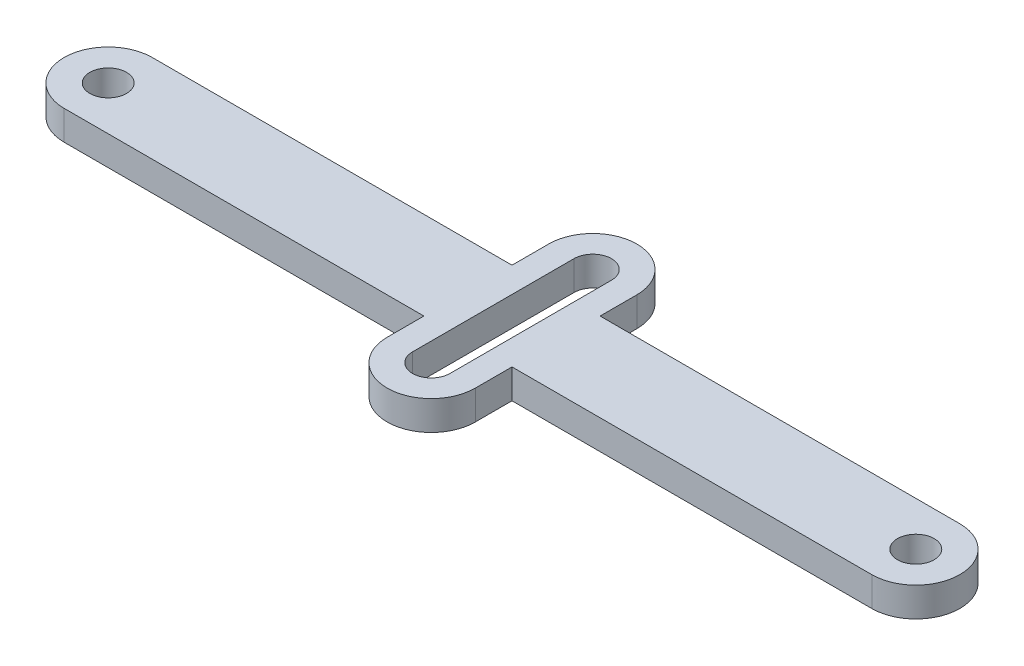
ISO-10303-21;
HEADER;
FILE_DESCRIPTION(('STEP AP214'),'2;1');
FILE_NAME('part.step','',(''),(''),'','','');
FILE_SCHEMA(('AUTOMOTIVE_DESIGN { 1 0 10303 214 1 1 1 1 }'));
ENDSEC;
DATA;
#1=APPLICATION_CONTEXT('core data for automotive mechanical design processes');
#2=APPLICATION_PROTOCOL_DEFINITION('international standard','automotive_design',2000,#1);
#3=PRODUCT_CONTEXT('',#1,'mechanical');
#4=PRODUCT('Part','Part','',(#3));
#5=PRODUCT_RELATED_PRODUCT_CATEGORY('part','',(#4));
#6=PRODUCT_DEFINITION_FORMATION('','',#4);
#7=PRODUCT_DEFINITION_CONTEXT('part definition',#1,'design');
#8=PRODUCT_DEFINITION('design','',#6,#7);
#9=PRODUCT_DEFINITION_SHAPE('','',#8);
#10=(LENGTH_UNIT() NAMED_UNIT(*) SI_UNIT(.MILLI.,.METRE.));
#11=(NAMED_UNIT(*) PLANE_ANGLE_UNIT() SI_UNIT($,.RADIAN.));
#12=(NAMED_UNIT(*) SI_UNIT($,.STERADIAN.) SOLID_ANGLE_UNIT());
#13=UNCERTAINTY_MEASURE_WITH_UNIT(LENGTH_MEASURE(1.E-05),#10,'distance_accuracy_value','');
#14=(GEOMETRIC_REPRESENTATION_CONTEXT(3) GLOBAL_UNCERTAINTY_ASSIGNED_CONTEXT((#13)) GLOBAL_UNIT_ASSIGNED_CONTEXT((#10,
#11,#12)) REPRESENTATION_CONTEXT('',''));
#15=CARTESIAN_POINT('',(0.,0.,0.));
#16=DIRECTION('',(0.,0.,1.));
#17=DIRECTION('',(1.,0.,0.));
#18=AXIS2_PLACEMENT_3D('',#15,#16,#17);
#19=CARTESIAN_POINT('',(-55.,4.,5.99999999999998));
#20=DIRECTION('',(0.,0.,-1.));
#21=DIRECTION('',(-1.,0.,0.));
#22=AXIS2_PLACEMENT_3D('',#19,#20,#21);
#23=PLANE('',#22);
#24=DIRECTION('',(1.,0.,0.));
#25=VECTOR('',#24,1.);
#26=CARTESIAN_POINT('',(-55.,0.,5.99999999999998));
#27=LINE('',#26,#25);
#28=CARTESIAN_POINT('',(-55.,0.,5.99999999999998));
#29=VERTEX_POINT('',#28);
#30=CARTESIAN_POINT('',(-6.00000000000001,0.,5.99999999999997));
#31=VERTEX_POINT('',#30);
#32=EDGE_CURVE('E285',#29,#31,#27,.T.);
#33=ORIENTED_EDGE('',*,*,#32,.T.);
#34=DIRECTION('',(0.,1.,0.));
#35=VECTOR('',#34,1.);
#36=CARTESIAN_POINT('',(-6.00000000000001,4.,5.99999999999997));
#37=LINE('',#36,#35);
#38=CARTESIAN_POINT('',(-6.00000000000001,4.,5.99999999999997));
#39=VERTEX_POINT('',#38);
#40=EDGE_CURVE('E242',#31,#39,#37,.T.);
#41=ORIENTED_EDGE('',*,*,#40,.T.);
#42=DIRECTION('',(1.,0.,0.));
#43=VECTOR('',#42,1.);
#44=CARTESIAN_POINT('',(-55.,4.,5.99999999999998));
#45=LINE('',#44,#43);
#46=CARTESIAN_POINT('',(-55.,4.,5.99999999999998));
#47=VERTEX_POINT('',#46);
#48=EDGE_CURVE('E268',#47,#39,#45,.T.);
#49=ORIENTED_EDGE('',*,*,#48,.F.);
#50=DIRECTION('',(0.,-1.,0.));
#51=VECTOR('',#50,1.);
#52=CARTESIAN_POINT('',(-55.,4.,5.99999999999998));
#53=LINE('',#52,#51);
#54=EDGE_CURVE('E305',#47,#29,#53,.T.);
#55=ORIENTED_EDGE('',*,*,#54,.T.);
#56=EDGE_LOOP('',(#33,#41,#49,#55));
#57=FACE_BOUND('',#56,.T.);
#58=ADVANCED_FACE('F39',(#57),#23,.F.);
#59=CARTESIAN_POINT('',(-55.,4.,-5.99999999999994));
#60=DIRECTION('',(0.,0.,1.));
#61=DIRECTION('',(1.,0.,0.));
#62=AXIS2_PLACEMENT_3D('',#59,#60,#61);
#63=PLANE('',#62);
#64=DIRECTION('',(-1.,0.,0.));
#65=VECTOR('',#64,1.);
#66=CARTESIAN_POINT('',(-55.,4.,-5.99999999999994));
#67=LINE('',#66,#65);
#68=CARTESIAN_POINT('',(-6.00000000000001,4.,-5.99999999999995));
#69=VERTEX_POINT('',#68);
#70=CARTESIAN_POINT('',(-55.,4.,-5.99999999999994));
#71=VERTEX_POINT('',#70);
#72=EDGE_CURVE('E275',#69,#71,#67,.T.);
#73=ORIENTED_EDGE('',*,*,#72,.F.);
#74=DIRECTION('',(0.,-1.,0.));
#75=VECTOR('',#74,1.);
#76=CARTESIAN_POINT('',(-6.00000000000001,4.,-5.99999999999995));
#77=LINE('',#76,#75);
#78=CARTESIAN_POINT('',(-6.00000000000001,0.,-5.99999999999995));
#79=VERTEX_POINT('',#78);
#80=EDGE_CURVE('E312',#69,#79,#77,.T.);
#81=ORIENTED_EDGE('',*,*,#80,.T.);
#82=DIRECTION('',(-1.,0.,0.));
#83=VECTOR('',#82,1.);
#84=CARTESIAN_POINT('',(-55.,0.,-5.99999999999994));
#85=LINE('',#84,#83);
#86=CARTESIAN_POINT('',(-55.,0.,-5.99999999999994));
#87=VERTEX_POINT('',#86);
#88=EDGE_CURVE('E291',#79,#87,#85,.T.);
#89=ORIENTED_EDGE('',*,*,#88,.T.);
#90=DIRECTION('',(0.,-1.,0.));
#91=VECTOR('',#90,1.);
#92=CARTESIAN_POINT('',(-55.,4.,-5.99999999999994));
#93=LINE('',#92,#91);
#94=EDGE_CURVE('E280',#71,#87,#93,.T.);
#95=ORIENTED_EDGE('',*,*,#94,.F.);
#96=EDGE_LOOP('',(#73,#81,#89,#95));
#97=FACE_BOUND('',#96,.T.);
#98=ADVANCED_FACE('F342',(#97),#63,.F.);
#99=CARTESIAN_POINT('',(-55.,4.,0.));
#100=DIRECTION('',(0.,1.,0.));
#101=DIRECTION('',(0.,0.,1.));
#102=AXIS2_PLACEMENT_3D('',#99,#100,#101);
#103=PLANE('',#102);
#104=CARTESIAN_POINT('',(0.,4.,11.));
#105=DIRECTION('',(0.,1.,0.));
#106=DIRECTION('',(0.,0.,1.));
#107=AXIS2_PLACEMENT_3D('',#104,#105,#106);
#108=CIRCLE('',#107,2.55);
#109=CARTESIAN_POINT('',(-2.55,4.,11.));
#110=VERTEX_POINT('',#109);
#111=CARTESIAN_POINT('',(2.55000000000001,4.,11.));
#112=VERTEX_POINT('',#111);
#113=EDGE_CURVE('E55',#110,#112,#108,.T.);
#114=ORIENTED_EDGE('',*,*,#113,.F.);
#115=DIRECTION('',(0.,0.,1.));
#116=VECTOR('',#115,1.);
#117=CARTESIAN_POINT('',(-2.55,4.,11.));
#118=LINE('',#117,#116);
#119=CARTESIAN_POINT('',(-2.55000000000001,4.,-11.));
#120=VERTEX_POINT('',#119);
#121=EDGE_CURVE('E174',#120,#110,#118,.T.);
#122=ORIENTED_EDGE('',*,*,#121,.F.);
#123=CARTESIAN_POINT('',(0.,4.,-11.));
#124=DIRECTION('',(0.,1.,0.));
#125=DIRECTION('',(0.,0.,1.));
#126=AXIS2_PLACEMENT_3D('',#123,#124,#125);
#127=CIRCLE('',#126,2.55);
#128=CARTESIAN_POINT('',(2.55,4.,-11.));
#129=VERTEX_POINT('',#128);
#130=EDGE_CURVE('E156',#129,#120,#127,.T.);
#131=ORIENTED_EDGE('',*,*,#130,.F.);
#132=DIRECTION('',(0.,0.,-1.));
#133=VECTOR('',#132,1.);
#134=CARTESIAN_POINT('',(2.55,4.,11.));
#135=LINE('',#134,#133);
#136=EDGE_CURVE('E166',#112,#129,#135,.T.);
#137=ORIENTED_EDGE('',*,*,#136,.F.);
#138=EDGE_LOOP('',(#114,#122,#131,#137));
#139=FACE_BOUND('',#138,.T.);
#140=CARTESIAN_POINT('',(55.,4.,-5.99999999999996));
#141=VERTEX_POINT('',#140);
#142=CARTESIAN_POINT('',(6.,4.,-5.99999999999995));
#143=VERTEX_POINT('',#142);
#144=EDGE_CURVE('E276',#141,#143,#67,.T.);
#145=ORIENTED_EDGE('',*,*,#144,.T.);
#146=DIRECTION('',(0.,0.,-1.));
#147=VECTOR('',#146,1.);
#148=CARTESIAN_POINT('',(6.,4.,11.));
#149=LINE('',#148,#147);
#150=CARTESIAN_POINT('',(6.,4.,-11.));
#151=VERTEX_POINT('',#150);
#152=EDGE_CURVE('E207',#143,#151,#149,.T.);
#153=ORIENTED_EDGE('',*,*,#152,.T.);
#154=CARTESIAN_POINT('',(0.,4.,-11.));
#155=DIRECTION('',(0.,1.,0.));
#156=DIRECTION('',(0.,0.,1.));
#157=AXIS2_PLACEMENT_3D('',#154,#155,#156);
#158=CIRCLE('',#157,6.);
#159=CARTESIAN_POINT('',(-6.00000000000001,4.,-11.));
#160=VERTEX_POINT('',#159);
#161=EDGE_CURVE('E212',#151,#160,#158,.T.);
#162=ORIENTED_EDGE('',*,*,#161,.T.);
#163=DIRECTION('',(0.,0.,1.));
#164=VECTOR('',#163,1.);
#165=CARTESIAN_POINT('',(-6.,4.,11.));
#166=LINE('',#165,#164);
#167=EDGE_CURVE('E217',#160,#69,#166,.T.);
#168=ORIENTED_EDGE('',*,*,#167,.T.);
#169=ORIENTED_EDGE('',*,*,#72,.T.);
#170=CARTESIAN_POINT('',(-55.,4.,0.));
#171=DIRECTION('',(0.,1.,0.));
#172=DIRECTION('',(0.,0.,1.));
#173=AXIS2_PLACEMENT_3D('',#170,#171,#172);
#174=CIRCLE('',#173,5.99999999999996);
#175=EDGE_CURVE('E262',#71,#47,#174,.T.);
#176=ORIENTED_EDGE('',*,*,#175,.T.);
#177=ORIENTED_EDGE('',*,*,#48,.T.);
#178=CARTESIAN_POINT('',(-6.,4.,11.));
#179=VERTEX_POINT('',#178);
#180=EDGE_CURVE('E216',#39,#179,#166,.T.);
#181=ORIENTED_EDGE('',*,*,#180,.T.);
#182=CARTESIAN_POINT('',(0.,4.,11.));
#183=DIRECTION('',(0.,1.,0.));
#184=DIRECTION('',(0.,0.,1.));
#185=AXIS2_PLACEMENT_3D('',#182,#183,#184);
#186=CIRCLE('',#185,6.);
#187=CARTESIAN_POINT('',(6.,4.,11.));
#188=VERTEX_POINT('',#187);
#189=EDGE_CURVE('E186',#179,#188,#186,.T.);
#190=ORIENTED_EDGE('',*,*,#189,.T.);
#191=CARTESIAN_POINT('',(6.,4.,5.99999999999997));
#192=VERTEX_POINT('',#191);
#193=EDGE_CURVE('E208',#188,#192,#149,.T.);
#194=ORIENTED_EDGE('',*,*,#193,.T.);
#195=CARTESIAN_POINT('',(55.,4.,5.99999999999994));
#196=VERTEX_POINT('',#195);
#197=EDGE_CURVE('E266',#192,#196,#45,.T.);
#198=ORIENTED_EDGE('',*,*,#197,.T.);
#199=CARTESIAN_POINT('',(55.,4.,0.));
#200=DIRECTION('',(0.,1.,0.));
#201=DIRECTION('',(0.,0.,1.));
#202=AXIS2_PLACEMENT_3D('',#199,#200,#201);
#203=CIRCLE('',#202,5.99999999999996);
#204=EDGE_CURVE('E272',#196,#141,#203,.T.);
#205=ORIENTED_EDGE('',*,*,#204,.T.);
#206=EDGE_LOOP('',(#145,#153,#162,#168,#169,#176,#177,#181,#190,#194,#198,#205));
#207=FACE_BOUND('',#206,.T.);
#208=CARTESIAN_POINT('',(55.,4.,0.));
#209=DIRECTION('',(0.,1.,0.));
#210=DIRECTION('',(0.,0.,1.));
#211=AXIS2_PLACEMENT_3D('',#208,#209,#210);
#212=CIRCLE('',#211,2.5);
#213=CARTESIAN_POINT('',(55.,4.,2.49999999999998));
#214=VERTEX_POINT('',#213);
#215=EDGE_CURVE('E254',#214,#214,#212,.T.);
#216=ORIENTED_EDGE('',*,*,#215,.F.);
#217=EDGE_LOOP('',(#216));
#218=FACE_BOUND('',#217,.T.);
#219=CARTESIAN_POINT('',(-55.,4.,0.));
#220=DIRECTION('',(0.,1.,0.));
#221=DIRECTION('',(0.,0.,1.));
#222=AXIS2_PLACEMENT_3D('',#219,#220,#221);
#223=CIRCLE('',#222,2.5);
#224=CARTESIAN_POINT('',(-55.,4.,2.5));
#225=VERTEX_POINT('',#224);
#226=EDGE_CURVE('E246',#225,#225,#223,.T.);
#227=ORIENTED_EDGE('',*,*,#226,.F.);
#228=EDGE_LOOP('',(#227));
#229=FACE_BOUND('',#228,.T.);
#230=ADVANCED_FACE('F171',(#139,#207,#218,#229),#103,.T.);
#231=CARTESIAN_POINT('',(-55.,0.,0.));
#232=DIRECTION('',(0.,1.,0.));
#233=DIRECTION('',(0.,0.,1.));
#234=AXIS2_PLACEMENT_3D('',#231,#232,#233);
#235=PLANE('',#234);
#236=DIRECTION('',(0.,0.,1.));
#237=VECTOR('',#236,1.);
#238=CARTESIAN_POINT('',(-2.55,0.,0.));
#239=LINE('',#238,#237);
#240=CARTESIAN_POINT('',(-2.55000000000001,0.,-11.));
#241=VERTEX_POINT('',#240);
#242=CARTESIAN_POINT('',(-2.55,0.,11.));
#243=VERTEX_POINT('',#242);
#244=EDGE_CURVE('E48',#241,#243,#239,.T.);
#245=ORIENTED_EDGE('',*,*,#244,.T.);
#246=CARTESIAN_POINT('',(0.,0.,11.));
#247=DIRECTION('',(0.,1.,0.));
#248=DIRECTION('',(0.,0.,1.));
#249=AXIS2_PLACEMENT_3D('',#246,#247,#248);
#250=CIRCLE('',#249,2.55);
#251=CARTESIAN_POINT('',(2.55,0.,11.));
#252=VERTEX_POINT('',#251);
#253=EDGE_CURVE('E11',#243,#252,#250,.T.);
#254=ORIENTED_EDGE('',*,*,#253,.T.);
#255=DIRECTION('',(0.,0.,-1.));
#256=VECTOR('',#255,1.);
#257=CARTESIAN_POINT('',(2.55,0.,0.));
#258=LINE('',#257,#256);
#259=CARTESIAN_POINT('',(2.55,0.,-11.));
#260=VERTEX_POINT('',#259);
#261=EDGE_CURVE('E315',#252,#260,#258,.T.);
#262=ORIENTED_EDGE('',*,*,#261,.T.);
#263=CARTESIAN_POINT('',(0.,0.,-11.));
#264=DIRECTION('',(0.,1.,0.));
#265=DIRECTION('',(0.,0.,1.));
#266=AXIS2_PLACEMENT_3D('',#263,#264,#265);
#267=CIRCLE('',#266,2.55);
#268=EDGE_CURVE('E159',#260,#241,#267,.T.);
#269=ORIENTED_EDGE('',*,*,#268,.T.);
#270=EDGE_LOOP('',(#245,#254,#262,#269));
#271=FACE_BOUND('',#270,.T.);
#272=CARTESIAN_POINT('',(6.,0.,5.99999999999997));
#273=VERTEX_POINT('',#272);
#274=CARTESIAN_POINT('',(55.,0.,5.99999999999994));
#275=VERTEX_POINT('',#274);
#276=EDGE_CURVE('E284',#273,#275,#27,.T.);
#277=ORIENTED_EDGE('',*,*,#276,.F.);
#278=DIRECTION('',(0.,0.,1.));
#279=VECTOR('',#278,1.);
#280=CARTESIAN_POINT('',(6.,0.,11.));
#281=LINE('',#280,#279);
#282=CARTESIAN_POINT('',(6.,0.,11.));
#283=VERTEX_POINT('',#282);
#284=EDGE_CURVE('E203',#273,#283,#281,.T.);
#285=ORIENTED_EDGE('',*,*,#284,.T.);
#286=CARTESIAN_POINT('',(0.,0.,11.));
#287=DIRECTION('',(0.,1.,0.));
#288=DIRECTION('',(0.,0.,1.));
#289=AXIS2_PLACEMENT_3D('',#286,#287,#288);
#290=CIRCLE('',#289,6.);
#291=CARTESIAN_POINT('',(-6.,0.,11.));
#292=VERTEX_POINT('',#291);
#293=EDGE_CURVE('E200',#283,#292,#290,.F.);
#294=ORIENTED_EDGE('',*,*,#293,.T.);
#295=DIRECTION('',(0.,0.,-1.));
#296=VECTOR('',#295,1.);
#297=CARTESIAN_POINT('',(-6.,0.,11.));
#298=LINE('',#297,#296);
#299=EDGE_CURVE('E196',#292,#31,#298,.T.);
#300=ORIENTED_EDGE('',*,*,#299,.T.);
#301=ORIENTED_EDGE('',*,*,#32,.F.);
#302=CARTESIAN_POINT('',(-55.,0.,0.));
#303=DIRECTION('',(0.,1.,0.));
#304=DIRECTION('',(0.,0.,1.));
#305=AXIS2_PLACEMENT_3D('',#302,#303,#304);
#306=CIRCLE('',#305,5.99999999999996);
#307=EDGE_CURVE('E258',#87,#29,#306,.T.);
#308=ORIENTED_EDGE('',*,*,#307,.F.);
#309=ORIENTED_EDGE('',*,*,#88,.F.);
#310=CARTESIAN_POINT('',(-6.00000000000001,0.,-11.));
#311=VERTEX_POINT('',#310);
#312=EDGE_CURVE('E194',#79,#311,#298,.T.);
#313=ORIENTED_EDGE('',*,*,#312,.T.);
#314=CARTESIAN_POINT('',(0.,0.,-11.));
#315=DIRECTION('',(0.,1.,0.));
#316=DIRECTION('',(0.,0.,1.));
#317=AXIS2_PLACEMENT_3D('',#314,#315,#316);
#318=CIRCLE('',#317,6.);
#319=CARTESIAN_POINT('',(6.,0.,-11.));
#320=VERTEX_POINT('',#319);
#321=EDGE_CURVE('E191',#311,#320,#318,.F.);
#322=ORIENTED_EDGE('',*,*,#321,.T.);
#323=CARTESIAN_POINT('',(6.,0.,-5.99999999999995));
#324=VERTEX_POINT('',#323);
#325=EDGE_CURVE('E234',#320,#324,#281,.T.);
#326=ORIENTED_EDGE('',*,*,#325,.T.);
#327=CARTESIAN_POINT('',(55.,0.,-5.99999999999996));
#328=VERTEX_POINT('',#327);
#329=EDGE_CURVE('E267',#328,#324,#85,.T.);
#330=ORIENTED_EDGE('',*,*,#329,.F.);
#331=CARTESIAN_POINT('',(55.,0.,0.));
#332=DIRECTION('',(0.,1.,0.));
#333=DIRECTION('',(0.,0.,1.));
#334=AXIS2_PLACEMENT_3D('',#331,#332,#333);
#335=CIRCLE('',#334,5.99999999999996);
#336=EDGE_CURVE('E288',#275,#328,#335,.T.);
#337=ORIENTED_EDGE('',*,*,#336,.F.);
#338=EDGE_LOOP('',(#277,#285,#294,#300,#301,#308,#309,#313,#322,#326,#330,#337));
#339=FACE_BOUND('',#338,.T.);
#340=CARTESIAN_POINT('',(55.,0.,0.));
#341=DIRECTION('',(0.,1.,0.));
#342=DIRECTION('',(0.,0.,1.));
#343=AXIS2_PLACEMENT_3D('',#340,#341,#342);
#344=CIRCLE('',#343,2.5);
#345=CARTESIAN_POINT('',(55.,0.,2.49999999999998));
#346=VERTEX_POINT('',#345);
#347=EDGE_CURVE('E250',#346,#346,#344,.T.);
#348=ORIENTED_EDGE('',*,*,#347,.T.);
#349=EDGE_LOOP('',(#348));
#350=FACE_BOUND('',#349,.T.);
#351=CARTESIAN_POINT('',(-55.,0.,0.));
#352=DIRECTION('',(0.,1.,0.));
#353=DIRECTION('',(0.,0.,1.));
#354=AXIS2_PLACEMENT_3D('',#351,#352,#353);
#355=CIRCLE('',#354,2.5);
#356=CARTESIAN_POINT('',(-55.,0.,2.5));
#357=VERTEX_POINT('',#356);
#358=EDGE_CURVE('E245',#357,#357,#355,.T.);
#359=ORIENTED_EDGE('',*,*,#358,.T.);
#360=EDGE_LOOP('',(#359));
#361=FACE_BOUND('',#360,.T.);
#362=ADVANCED_FACE('F322',(#271,#339,#350,#361),#235,.F.);
#363=CARTESIAN_POINT('',(-55.,4.,0.));
#364=DIRECTION('',(0.,-1.,0.));
#365=DIRECTION('',(0.,0.,-1.));
#366=AXIS2_PLACEMENT_3D('',#363,#364,#365);
#367=CYLINDRICAL_SURFACE('',#366,5.99999999999996);
#368=ORIENTED_EDGE('',*,*,#307,.T.);
#369=ORIENTED_EDGE('',*,*,#54,.F.);
#370=ORIENTED_EDGE('',*,*,#175,.F.);
#371=ORIENTED_EDGE('',*,*,#94,.T.);
#372=EDGE_LOOP('',(#368,#369,#370,#371));
#373=FACE_BOUND('',#372,.T.);
#374=ADVANCED_FACE('F41',(#373),#367,.T.);
#375=ORIENTED_EDGE('',*,*,#197,.F.);
#376=DIRECTION('',(0.,-1.,0.));
#377=VECTOR('',#376,1.);
#378=CARTESIAN_POINT('',(6.00000000000001,4.,5.99999999999997));
#379=LINE('',#378,#377);
#380=EDGE_CURVE('E238',#192,#273,#379,.T.);
#381=ORIENTED_EDGE('',*,*,#380,.T.);
#382=ORIENTED_EDGE('',*,*,#276,.T.);
#383=DIRECTION('',(0.,-1.,0.));
#384=VECTOR('',#383,1.);
#385=CARTESIAN_POINT('',(55.,4.,5.99999999999994));
#386=LINE('',#385,#384);
#387=EDGE_CURVE('E301',#196,#275,#386,.T.);
#388=ORIENTED_EDGE('',*,*,#387,.F.);
#389=EDGE_LOOP('',(#375,#381,#382,#388));
#390=FACE_BOUND('',#389,.T.);
#391=ADVANCED_FACE('F344',(#390),#23,.F.);
#392=CARTESIAN_POINT('',(55.,4.,0.));
#393=DIRECTION('',(0.,-1.,0.));
#394=DIRECTION('',(0.,0.,-1.));
#395=AXIS2_PLACEMENT_3D('',#392,#393,#394);
#396=CYLINDRICAL_SURFACE('',#395,5.99999999999996);
#397=ORIENTED_EDGE('',*,*,#336,.T.);
#398=DIRECTION('',(0.,-1.,0.));
#399=VECTOR('',#398,1.);
#400=CARTESIAN_POINT('',(55.,4.,-5.99999999999996));
#401=LINE('',#400,#399);
#402=EDGE_CURVE('E297',#141,#328,#401,.T.);
#403=ORIENTED_EDGE('',*,*,#402,.F.);
#404=ORIENTED_EDGE('',*,*,#204,.F.);
#405=ORIENTED_EDGE('',*,*,#387,.T.);
#406=EDGE_LOOP('',(#397,#403,#404,#405));
#407=FACE_BOUND('',#406,.T.);
#408=ADVANCED_FACE('F353',(#407),#396,.T.);
#409=ORIENTED_EDGE('',*,*,#329,.T.);
#410=DIRECTION('',(0.,1.,0.));
#411=VECTOR('',#410,1.);
#412=CARTESIAN_POINT('',(6.00000000000001,4.,-5.99999999999995));
#413=LINE('',#412,#411);
#414=EDGE_CURVE('E309',#324,#143,#413,.T.);
#415=ORIENTED_EDGE('',*,*,#414,.T.);
#416=ORIENTED_EDGE('',*,*,#144,.F.);
#417=ORIENTED_EDGE('',*,*,#402,.T.);
#418=EDGE_LOOP('',(#409,#415,#416,#417));
#419=FACE_BOUND('',#418,.T.);
#420=ADVANCED_FACE('F350',(#419),#63,.F.);
#421=CARTESIAN_POINT('',(55.,4.,0.));
#422=DIRECTION('',(0.,-1.,0.));
#423=DIRECTION('',(0.,0.,-1.));
#424=AXIS2_PLACEMENT_3D('',#421,#422,#423);
#425=CYLINDRICAL_SURFACE('',#424,2.5);
#426=ORIENTED_EDGE('',*,*,#215,.T.);
#427=EDGE_LOOP('',(#426));
#428=FACE_BOUND('',#427,.T.);
#429=ORIENTED_EDGE('',*,*,#347,.F.);
#430=EDGE_LOOP('',(#429));
#431=FACE_BOUND('',#430,.T.);
#432=ADVANCED_FACE('F410',(#428,#431),#425,.F.);
#433=CARTESIAN_POINT('',(-55.,4.,0.));
#434=DIRECTION('',(0.,-1.,0.));
#435=DIRECTION('',(0.,0.,-1.));
#436=AXIS2_PLACEMENT_3D('',#433,#434,#435);
#437=CYLINDRICAL_SURFACE('',#436,2.5);
#438=ORIENTED_EDGE('',*,*,#226,.T.);
#439=EDGE_LOOP('',(#438));
#440=FACE_BOUND('',#439,.T.);
#441=ORIENTED_EDGE('',*,*,#358,.F.);
#442=EDGE_LOOP('',(#441));
#443=FACE_BOUND('',#442,.T.);
#444=ADVANCED_FACE('F414',(#440,#443),#437,.F.);
#445=CARTESIAN_POINT('',(0.,-36.0555127546399,-11.));
#446=DIRECTION('',(0.,1.,0.));
#447=DIRECTION('',(0.,0.,1.));
#448=AXIS2_PLACEMENT_3D('',#445,#446,#447);
#449=CYLINDRICAL_SURFACE('',#448,6.);
#450=ORIENTED_EDGE('',*,*,#321,.F.);
#451=DIRECTION('',(0.,1.,0.));
#452=VECTOR('',#451,1.);
#453=CARTESIAN_POINT('',(-6.00000000000001,-36.0555127546399,-11.));
#454=LINE('',#453,#452);
#455=EDGE_CURVE('E225',#311,#160,#454,.T.);
#456=ORIENTED_EDGE('',*,*,#455,.T.);
#457=ORIENTED_EDGE('',*,*,#161,.F.);
#458=DIRECTION('',(0.,1.,0.));
#459=VECTOR('',#458,1.);
#460=CARTESIAN_POINT('',(6.,-36.0555127546399,-11.));
#461=LINE('',#460,#459);
#462=EDGE_CURVE('E228',#320,#151,#461,.T.);
#463=ORIENTED_EDGE('',*,*,#462,.F.);
#464=EDGE_LOOP('',(#450,#456,#457,#463));
#465=FACE_BOUND('',#464,.T.);
#466=ADVANCED_FACE('F404',(#465),#449,.T.);
#467=CARTESIAN_POINT('',(6.,-36.0555127546399,11.));
#468=DIRECTION('',(1.,0.,0.));
#469=DIRECTION('',(0.,0.,-1.));
#470=AXIS2_PLACEMENT_3D('',#467,#468,#469);
#471=PLANE('',#470);
#472=ORIENTED_EDGE('',*,*,#414,.F.);
#473=ORIENTED_EDGE('',*,*,#325,.F.);
#474=ORIENTED_EDGE('',*,*,#462,.T.);
#475=ORIENTED_EDGE('',*,*,#152,.F.);
#476=EDGE_LOOP('',(#472,#473,#474,#475));
#477=FACE_BOUND('',#476,.T.);
#478=ADVANCED_FACE('F402',(#477),#471,.T.);
#479=CARTESIAN_POINT('',(-6.,-36.0555127546399,11.));
#480=DIRECTION('',(-1.,0.,0.));
#481=DIRECTION('',(0.,0.,1.));
#482=AXIS2_PLACEMENT_3D('',#479,#480,#481);
#483=PLANE('',#482);
#484=ORIENTED_EDGE('',*,*,#80,.F.);
#485=ORIENTED_EDGE('',*,*,#167,.F.);
#486=ORIENTED_EDGE('',*,*,#455,.F.);
#487=ORIENTED_EDGE('',*,*,#312,.F.);
#488=EDGE_LOOP('',(#484,#485,#486,#487));
#489=FACE_BOUND('',#488,.T.);
#490=ADVANCED_FACE('F390',(#489),#483,.T.);
#491=ORIENTED_EDGE('',*,*,#40,.F.);
#492=ORIENTED_EDGE('',*,*,#299,.F.);
#493=DIRECTION('',(0.,1.,0.));
#494=VECTOR('',#493,1.);
#495=CARTESIAN_POINT('',(-6.,-36.0555127546399,11.));
#496=LINE('',#495,#494);
#497=EDGE_CURVE('E195',#292,#179,#496,.T.);
#498=ORIENTED_EDGE('',*,*,#497,.T.);
#499=ORIENTED_EDGE('',*,*,#180,.F.);
#500=EDGE_LOOP('',(#491,#492,#498,#499));
#501=FACE_BOUND('',#500,.T.);
#502=ADVANCED_FACE('F378',(#501),#483,.T.);
#503=ORIENTED_EDGE('',*,*,#380,.F.);
#504=ORIENTED_EDGE('',*,*,#193,.F.);
#505=DIRECTION('',(0.,1.,0.));
#506=VECTOR('',#505,1.);
#507=CARTESIAN_POINT('',(6.,-36.0555127546399,11.));
#508=LINE('',#507,#506);
#509=EDGE_CURVE('E221',#283,#188,#508,.T.);
#510=ORIENTED_EDGE('',*,*,#509,.F.);
#511=ORIENTED_EDGE('',*,*,#284,.F.);
#512=EDGE_LOOP('',(#503,#504,#510,#511));
#513=FACE_BOUND('',#512,.T.);
#514=ADVANCED_FACE('F336',(#513),#471,.T.);
#515=CARTESIAN_POINT('',(0.,-36.0555127546399,11.));
#516=DIRECTION('',(0.,1.,0.));
#517=DIRECTION('',(0.,0.,1.));
#518=AXIS2_PLACEMENT_3D('',#515,#516,#517);
#519=CYLINDRICAL_SURFACE('',#518,6.);
#520=ORIENTED_EDGE('',*,*,#293,.F.);
#521=ORIENTED_EDGE('',*,*,#509,.T.);
#522=ORIENTED_EDGE('',*,*,#189,.F.);
#523=ORIENTED_EDGE('',*,*,#497,.F.);
#524=EDGE_LOOP('',(#520,#521,#522,#523));
#525=FACE_BOUND('',#524,.T.);
#526=ADVANCED_FACE('F329',(#525),#519,.T.);
#527=CARTESIAN_POINT('',(0.,-1.,11.));
#528=DIRECTION('',(0.,1.,0.));
#529=DIRECTION('',(0.,0.,1.));
#530=AXIS2_PLACEMENT_3D('',#527,#528,#529);
#531=CYLINDRICAL_SURFACE('',#530,2.55);
#532=DIRECTION('',(0.,1.,0.));
#533=VECTOR('',#532,1.);
#534=CARTESIAN_POINT('',(-2.55,-1.,11.));
#535=LINE('',#534,#533);
#536=EDGE_CURVE('E183',#243,#110,#535,.T.);
#537=ORIENTED_EDGE('',*,*,#536,.T.);
#538=ORIENTED_EDGE('',*,*,#113,.T.);
#539=DIRECTION('',(0.,1.,0.));
#540=VECTOR('',#539,1.);
#541=CARTESIAN_POINT('',(2.55,-1.,11.));
#542=LINE('',#541,#540);
#543=EDGE_CURVE('E163',#252,#112,#542,.T.);
#544=ORIENTED_EDGE('',*,*,#543,.F.);
#545=ORIENTED_EDGE('',*,*,#253,.F.);
#546=EDGE_LOOP('',(#537,#538,#544,#545));
#547=FACE_BOUND('',#546,.T.);
#548=ADVANCED_FACE('F327',(#547),#531,.F.);
#549=CARTESIAN_POINT('',(-2.55,-1.,11.));
#550=DIRECTION('',(-1.,0.,0.));
#551=DIRECTION('',(0.,0.,1.));
#552=AXIS2_PLACEMENT_3D('',#549,#550,#551);
#553=PLANE('',#552);
#554=DIRECTION('',(0.,1.,0.));
#555=VECTOR('',#554,1.);
#556=CARTESIAN_POINT('',(-2.55000000000001,-1.,-11.));
#557=LINE('',#556,#555);
#558=EDGE_CURVE('E162',#241,#120,#557,.T.);
#559=ORIENTED_EDGE('',*,*,#558,.T.);
#560=ORIENTED_EDGE('',*,*,#121,.T.);
#561=ORIENTED_EDGE('',*,*,#536,.F.);
#562=ORIENTED_EDGE('',*,*,#244,.F.);
#563=EDGE_LOOP('',(#559,#560,#561,#562));
#564=FACE_BOUND('',#563,.T.);
#565=ADVANCED_FACE('F326',(#564),#553,.F.);
#566=CARTESIAN_POINT('',(0.,-1.,-11.));
#567=DIRECTION('',(0.,1.,0.));
#568=DIRECTION('',(0.,0.,1.));
#569=AXIS2_PLACEMENT_3D('',#566,#567,#568);
#570=CYLINDRICAL_SURFACE('',#569,2.55);
#571=DIRECTION('',(0.,1.,0.));
#572=VECTOR('',#571,1.);
#573=CARTESIAN_POINT('',(2.55,-1.,-11.));
#574=LINE('',#573,#572);
#575=EDGE_CURVE('E63',#260,#129,#574,.T.);
#576=ORIENTED_EDGE('',*,*,#575,.T.);
#577=ORIENTED_EDGE('',*,*,#130,.T.);
#578=ORIENTED_EDGE('',*,*,#558,.F.);
#579=ORIENTED_EDGE('',*,*,#268,.F.);
#580=EDGE_LOOP('',(#576,#577,#578,#579));
#581=FACE_BOUND('',#580,.T.);
#582=ADVANCED_FACE('F153',(#581),#570,.F.);
#583=CARTESIAN_POINT('',(2.55,-1.,11.));
#584=DIRECTION('',(1.,0.,0.));
#585=DIRECTION('',(0.,0.,-1.));
#586=AXIS2_PLACEMENT_3D('',#583,#584,#585);
#587=PLANE('',#586);
#588=ORIENTED_EDGE('',*,*,#543,.T.);
#589=ORIENTED_EDGE('',*,*,#136,.T.);
#590=ORIENTED_EDGE('',*,*,#575,.F.);
#591=ORIENTED_EDGE('',*,*,#261,.F.);
#592=EDGE_LOOP('',(#588,#589,#590,#591));
#593=FACE_BOUND('',#592,.T.);
#594=ADVANCED_FACE('F167',(#593),#587,.F.);
#595=CLOSED_SHELL('',(#58,#98,#230,#362,#374,#391,#408,#420,#432,#444,#466,#478,#490,#502,#514,
#526,#548,#565,#582,#594));
#596=MANIFOLD_SOLID_BREP('B2',#595);
#597=ADVANCED_BREP_SHAPE_REPRESENTATION('',(#18,#596),#14);
#598=SHAPE_DEFINITION_REPRESENTATION(#9,#597);
ENDSEC;
END-ISO-10303-21;
